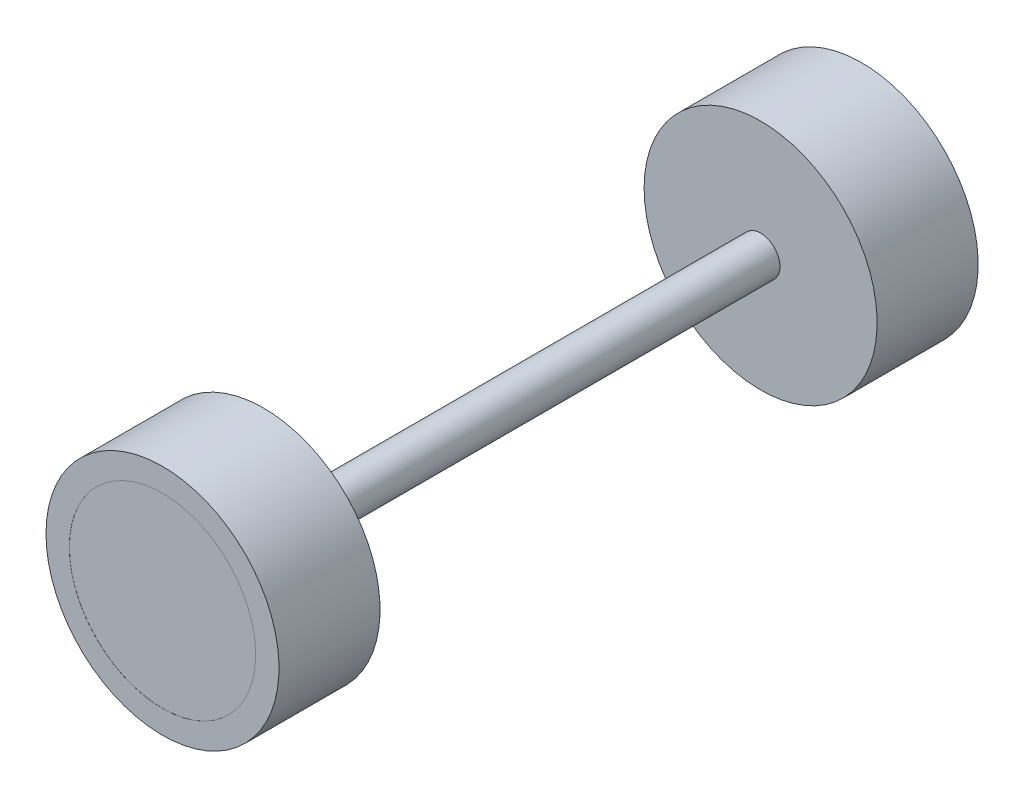
ISO-10303-21;
HEADER;
FILE_DESCRIPTION(('STEP AP214'),'2;1');
FILE_NAME('part.step','',(''),(''),'','','');
FILE_SCHEMA(('AUTOMOTIVE_DESIGN { 1 0 10303 214 1 1 1 1 }'));
ENDSEC;
DATA;
#1=APPLICATION_CONTEXT('core data for automotive mechanical design processes');
#2=APPLICATION_PROTOCOL_DEFINITION('international standard','automotive_design',2000,#1);
#3=PRODUCT_CONTEXT('',#1,'mechanical');
#4=PRODUCT('Part','Part','',(#3));
#5=PRODUCT_RELATED_PRODUCT_CATEGORY('part','',(#4));
#6=PRODUCT_DEFINITION_FORMATION('','',#4);
#7=PRODUCT_DEFINITION_CONTEXT('part definition',#1,'design');
#8=PRODUCT_DEFINITION('design','',#6,#7);
#9=PRODUCT_DEFINITION_SHAPE('','',#8);
#10=(LENGTH_UNIT() NAMED_UNIT(*) SI_UNIT(.MILLI.,.METRE.));
#11=(NAMED_UNIT(*) PLANE_ANGLE_UNIT() SI_UNIT($,.RADIAN.));
#12=(NAMED_UNIT(*) SI_UNIT($,.STERADIAN.) SOLID_ANGLE_UNIT());
#13=UNCERTAINTY_MEASURE_WITH_UNIT(LENGTH_MEASURE(1.E-05),#10,'distance_accuracy_value','');
#14=(GEOMETRIC_REPRESENTATION_CONTEXT(3) GLOBAL_UNCERTAINTY_ASSIGNED_CONTEXT((#13)) GLOBAL_UNIT_ASSIGNED_CONTEXT((#10,
#11,#12)) REPRESENTATION_CONTEXT('',''));
#15=CARTESIAN_POINT('',(0.,0.,0.));
#16=DIRECTION('',(0.,0.,1.));
#17=DIRECTION('',(1.,0.,0.));
#18=AXIS2_PLACEMENT_3D('',#15,#16,#17);
#19=CARTESIAN_POINT('',(15.,0.,13.));
#20=DIRECTION('',(0.,0.,1.));
#21=DIRECTION('',(1.,0.,0.));
#22=AXIS2_PLACEMENT_3D('',#19,#20,#21);
#23=PLANE('',#22);
#24=CARTESIAN_POINT('',(0.,0.,13.));
#25=DIRECTION('',(0.,0.,1.));
#26=DIRECTION('',(1.,0.,0.));
#27=AXIS2_PLACEMENT_3D('',#24,#25,#26);
#28=CIRCLE('',#27,15.);
#29=CARTESIAN_POINT('',(-15.,0.,13.));
#30=VERTEX_POINT('',#29);
#31=EDGE_CURVE('E11',#30,#30,#28,.T.);
#32=ORIENTED_EDGE('',*,*,#31,.T.);
#33=EDGE_LOOP('',(#32));
#34=FACE_BOUND('',#33,.T.);
#35=ADVANCED_FACE('F46',(#34),#23,.T.);
#36=CARTESIAN_POINT('',(0.,0.,13.));
#37=DIRECTION('',(0.,0.,-1.));
#38=DIRECTION('',(-1.,0.,0.));
#39=AXIS2_PLACEMENT_3D('',#36,#37,#38);
#40=CYLINDRICAL_SURFACE('',#39,15.);
#41=CARTESIAN_POINT('',(0.,0.,-0.01));
#42=DIRECTION('',(0.,0.,-1.));
#43=DIRECTION('',(-1.,0.,0.));
#44=AXIS2_PLACEMENT_3D('',#41,#42,#43);
#45=CIRCLE('',#44,15.);
#46=CARTESIAN_POINT('',(-15.,0.,-0.00999999999999959));
#47=VERTEX_POINT('',#46);
#48=EDGE_CURVE('E52',#47,#47,#45,.T.);
#49=CARTESIAN_POINT('',(-15.,0.,13.));
#50=CARTESIAN_POINT('',(-15.,0.,12.8644791666667));
#51=CARTESIAN_POINT('',(-15.,0.,12.7289583333333));
#52=CARTESIAN_POINT('',(-15.,0.,12.4579166666667));
#53=CARTESIAN_POINT('',(-15.,0.,12.3223958333333));
#54=CARTESIAN_POINT('',(-15.,0.,12.0513541666667));
#55=CARTESIAN_POINT('',(-15.,0.,11.9158333333333));
#56=CARTESIAN_POINT('',(-15.,0.,11.6447916666667));
#57=CARTESIAN_POINT('',(-15.,0.,11.5092708333333));
#58=CARTESIAN_POINT('',(-15.,0.,11.2382291666667));
#59=CARTESIAN_POINT('',(-15.,0.,11.1027083333333));
#60=CARTESIAN_POINT('',(-15.,0.,10.8316666666667));
#61=CARTESIAN_POINT('',(-15.,0.,10.6961458333333));
#62=CARTESIAN_POINT('',(-15.,0.,10.4251041666667));
#63=CARTESIAN_POINT('',(-15.,0.,10.2895833333333));
#64=CARTESIAN_POINT('',(-15.,0.,10.0185416666667));
#65=CARTESIAN_POINT('',(-15.,0.,9.88302083333333));
#66=CARTESIAN_POINT('',(-15.,0.,9.61197916666667));
#67=CARTESIAN_POINT('',(-15.,0.,9.47645833333333));
#68=CARTESIAN_POINT('',(-15.,0.,9.20541666666667));
#69=CARTESIAN_POINT('',(-15.,0.,9.06989583333333));
#70=CARTESIAN_POINT('',(-15.,0.,8.79885416666667));
#71=CARTESIAN_POINT('',(-15.,0.,8.66333333333333));
#72=CARTESIAN_POINT('',(-15.,0.,8.39229166666667));
#73=CARTESIAN_POINT('',(-15.,0.,8.25677083333333));
#74=CARTESIAN_POINT('',(-15.,0.,7.98572916666667));
#75=CARTESIAN_POINT('',(-15.,0.,7.85020833333333));
#76=CARTESIAN_POINT('',(-15.,0.,7.57916666666667));
#77=CARTESIAN_POINT('',(-15.,0.,7.44364583333333));
#78=CARTESIAN_POINT('',(-15.,0.,7.17260416666667));
#79=CARTESIAN_POINT('',(-15.,0.,7.03708333333333));
#80=CARTESIAN_POINT('',(-15.,0.,6.76604166666667));
#81=CARTESIAN_POINT('',(-15.,0.,6.63052083333333));
#82=CARTESIAN_POINT('',(-15.,0.,6.35947916666667));
#83=CARTESIAN_POINT('',(-15.,0.,6.22395833333333));
#84=CARTESIAN_POINT('',(-15.,0.,5.95291666666667));
#85=CARTESIAN_POINT('',(-15.,0.,5.81739583333333));
#86=CARTESIAN_POINT('',(-15.,0.,5.54635416666667));
#87=CARTESIAN_POINT('',(-15.,0.,5.41083333333333));
#88=CARTESIAN_POINT('',(-15.,0.,5.13979166666667));
#89=CARTESIAN_POINT('',(-15.,0.,5.00427083333333));
#90=CARTESIAN_POINT('',(-15.,0.,4.73322916666667));
#91=CARTESIAN_POINT('',(-15.,0.,4.59770833333333));
#92=CARTESIAN_POINT('',(-15.,0.,4.32666666666667));
#93=CARTESIAN_POINT('',(-15.,0.,4.19114583333333));
#94=CARTESIAN_POINT('',(-15.,0.,3.92010416666667));
#95=CARTESIAN_POINT('',(-15.,0.,3.78458333333333));
#96=CARTESIAN_POINT('',(-15.,0.,3.51354166666667));
#97=CARTESIAN_POINT('',(-15.,0.,3.37802083333333));
#98=CARTESIAN_POINT('',(-15.,0.,3.10697916666667));
#99=CARTESIAN_POINT('',(-15.,0.,2.97145833333333));
#100=CARTESIAN_POINT('',(-15.,0.,2.70041666666667));
#101=CARTESIAN_POINT('',(-15.,0.,2.56489583333333));
#102=CARTESIAN_POINT('',(-15.,0.,2.29385416666667));
#103=CARTESIAN_POINT('',(-15.,0.,2.15833333333333));
#104=CARTESIAN_POINT('',(-15.,0.,1.88729166666667));
#105=CARTESIAN_POINT('',(-15.,0.,1.75177083333333));
#106=CARTESIAN_POINT('',(-15.,0.,1.48072916666667));
#107=CARTESIAN_POINT('',(-15.,0.,1.34520833333333));
#108=CARTESIAN_POINT('',(-15.,0.,1.07416666666667));
#109=CARTESIAN_POINT('',(-15.,0.,0.938645833333334));
#110=CARTESIAN_POINT('',(-15.,0.,0.667604166666667));
#111=CARTESIAN_POINT('',(-15.,0.,0.532083333333334));
#112=CARTESIAN_POINT('',(-15.,0.,0.261041666666668));
#113=CARTESIAN_POINT('',(-15.,0.,0.125520833333334));
#114=CARTESIAN_POINT('',(-15.,0.,-0.00999999999999959));
#115=B_SPLINE_CURVE_WITH_KNOTS('',3,(#49,#50,#51,#52,#53,#54,#55,#56,#57,#58,#59,#60,#61,#62,
#63,#64,#65,#66,#67,#68,#69,#70,#71,#72,#73,#74,#75,#76,#77,#78,#79,#80,#81,#82,#83,#84,#85,#86,
#87,#88,#89,#90,#91,#92,#93,#94,#95,#96,#97,#98,#99,#100,#101,#102,#103,#104,#105,#106,#107,
#108,#109,#110,#111,#112,#113,#114),.UNSPECIFIED.,.F.,.F.,(4,2,2,2,2,2,2,2,2,2,2,2,2,2,2,2,2,2,
2,2,2,2,2,2,2,2,2,2,2,2,2,2,4),(0.,0.406562499999999,0.813125,1.2196875,1.62625,2.0328125,
2.439375,2.8459375,3.2525,3.6590625,4.065625,4.4721875,4.87875,5.2853125,5.691875,6.0984375,
6.505,6.9115625,7.318125,7.7246875,8.13125,8.5378125,8.944375,9.3509375,9.7575,10.1640625,
10.570625,10.9771875,11.38375,11.7903125,12.196875,12.6034375,13.01),.UNSPECIFIED.);
#116=EDGE_CURVE('BSEAM77',#30,#47,#115,.T.);
#117=ORIENTED_EDGE('',*,*,#31,.F.);
#118=ORIENTED_EDGE('',*,*,#48,.F.);
#119=ORIENTED_EDGE('',*,*,#116,.T.);
#120=ORIENTED_EDGE('',*,*,#116,.F.);
#121=EDGE_LOOP('',(#117,#119,#118,#120));
#122=FACE_BOUND('',#121,.T.);
#123=ADVANCED_FACE('F77',(#122),#40,.T.);
#124=CARTESIAN_POINT('',(0.,0.,-0.01));
#125=DIRECTION('',(0.,0.,-1.));
#126=DIRECTION('',(-1.,0.,0.));
#127=AXIS2_PLACEMENT_3D('',#124,#125,#126);
#128=PLANE('',#127);
#129=ORIENTED_EDGE('',*,*,#48,.T.);
#130=EDGE_LOOP('',(#129));
#131=FACE_BOUND('',#130,.T.);
#132=CARTESIAN_POINT('',(0.,0.,-0.01));
#133=DIRECTION('',(0.,0.,-1.));
#134=DIRECTION('',(-1.,0.,0.));
#135=AXIS2_PLACEMENT_3D('',#132,#133,#134);
#136=CIRCLE('',#135,12.);
#137=CARTESIAN_POINT('',(12.,0.,-0.01));
#138=VERTEX_POINT('',#137);
#139=EDGE_CURVE('E56',#138,#138,#136,.T.);
#140=ORIENTED_EDGE('',*,*,#139,.F.);
#141=EDGE_LOOP('',(#140));
#142=FACE_BOUND('',#141,.T.);
#143=ADVANCED_FACE('F70',(#131,#142),#128,.T.);
#144=CARTESIAN_POINT('',(0.,0.,-0.01));
#145=DIRECTION('',(0.,0.,1.));
#146=DIRECTION('',(1.,0.,0.));
#147=AXIS2_PLACEMENT_3D('',#144,#145,#146);
#148=CYLINDRICAL_SURFACE('',#147,12.);
#149=CARTESIAN_POINT('',(0.,0.,0.));
#150=DIRECTION('',(0.,0.,-1.));
#151=DIRECTION('',(-1.,0.,0.));
#152=AXIS2_PLACEMENT_3D('',#149,#150,#151);
#153=CIRCLE('',#152,12.);
#154=CARTESIAN_POINT('',(12.,0.,0.));
#155=VERTEX_POINT('',#154);
#156=EDGE_CURVE('E60',#155,#155,#153,.T.);
#157=CARTESIAN_POINT('',(12.,0.,-0.01));
#158=CARTESIAN_POINT('',(12.,0.,-0.00989583333333333));
#159=CARTESIAN_POINT('',(12.,0.,-0.00979166666666667));
#160=CARTESIAN_POINT('',(12.,0.,-0.00958333333333333));
#161=CARTESIAN_POINT('',(12.,0.,-0.00947916666666667));
#162=CARTESIAN_POINT('',(12.,0.,-0.00927083333333333));
#163=CARTESIAN_POINT('',(12.,0.,-0.00916666666666667));
#164=CARTESIAN_POINT('',(12.,0.,-0.00895833333333333));
#165=CARTESIAN_POINT('',(12.,0.,-0.00885416666666667));
#166=CARTESIAN_POINT('',(12.,0.,-0.00864583333333333));
#167=CARTESIAN_POINT('',(12.,0.,-0.00854166666666667));
#168=CARTESIAN_POINT('',(12.,0.,-0.00833333333333333));
#169=CARTESIAN_POINT('',(12.,0.,-0.00822916666666667));
#170=CARTESIAN_POINT('',(12.,0.,-0.00802083333333333));
#171=CARTESIAN_POINT('',(12.,0.,-0.00791666666666667));
#172=CARTESIAN_POINT('',(12.,0.,-0.00770833333333333));
#173=CARTESIAN_POINT('',(12.,0.,-0.00760416666666667));
#174=CARTESIAN_POINT('',(12.,0.,-0.00739583333333333));
#175=CARTESIAN_POINT('',(12.,0.,-0.00729166666666667));
#176=CARTESIAN_POINT('',(12.,0.,-0.00708333333333333));
#177=CARTESIAN_POINT('',(12.,0.,-0.00697916666666667));
#178=CARTESIAN_POINT('',(12.,0.,-0.00677083333333333));
#179=CARTESIAN_POINT('',(12.,0.,-0.00666666666666667));
#180=CARTESIAN_POINT('',(12.,0.,-0.00645833333333333));
#181=CARTESIAN_POINT('',(12.,0.,-0.00635416666666667));
#182=CARTESIAN_POINT('',(12.,0.,-0.00614583333333333));
#183=CARTESIAN_POINT('',(12.,0.,-0.00604166666666667));
#184=CARTESIAN_POINT('',(12.,0.,-0.00583333333333333));
#185=CARTESIAN_POINT('',(12.,0.,-0.00572916666666667));
#186=CARTESIAN_POINT('',(12.,0.,-0.00552083333333333));
#187=CARTESIAN_POINT('',(12.,0.,-0.00541666666666667));
#188=CARTESIAN_POINT('',(12.,0.,-0.00520833333333333));
#189=CARTESIAN_POINT('',(12.,0.,-0.00510416666666667));
#190=CARTESIAN_POINT('',(12.,0.,-0.00489583333333333));
#191=CARTESIAN_POINT('',(12.,0.,-0.00479166666666667));
#192=CARTESIAN_POINT('',(12.,0.,-0.00458333333333333));
#193=CARTESIAN_POINT('',(12.,0.,-0.00447916666666667));
#194=CARTESIAN_POINT('',(12.,0.,-0.00427083333333333));
#195=CARTESIAN_POINT('',(12.,0.,-0.00416666666666667));
#196=CARTESIAN_POINT('',(12.,0.,-0.00395833333333333));
#197=CARTESIAN_POINT('',(12.,0.,-0.00385416666666667));
#198=CARTESIAN_POINT('',(12.,0.,-0.00364583333333333));
#199=CARTESIAN_POINT('',(12.,0.,-0.00354166666666667));
#200=CARTESIAN_POINT('',(12.,0.,-0.00333333333333333));
#201=CARTESIAN_POINT('',(12.,0.,-0.00322916666666667));
#202=CARTESIAN_POINT('',(12.,0.,-0.00302083333333333));
#203=CARTESIAN_POINT('',(12.,0.,-0.00291666666666667));
#204=CARTESIAN_POINT('',(12.,0.,-0.00270833333333333));
#205=CARTESIAN_POINT('',(12.,0.,-0.00260416666666667));
#206=CARTESIAN_POINT('',(12.,0.,-0.00239583333333333));
#207=CARTESIAN_POINT('',(12.,0.,-0.00229166666666667));
#208=CARTESIAN_POINT('',(12.,0.,-0.00208333333333333));
#209=CARTESIAN_POINT('',(12.,0.,-0.00197916666666667));
#210=CARTESIAN_POINT('',(12.,0.,-0.00177083333333333));
#211=CARTESIAN_POINT('',(12.,0.,-0.00166666666666667));
#212=CARTESIAN_POINT('',(12.,0.,-0.00145833333333333));
#213=CARTESIAN_POINT('',(12.,0.,-0.00135416666666667));
#214=CARTESIAN_POINT('',(12.,0.,-0.00114583333333333));
#215=CARTESIAN_POINT('',(12.,0.,-0.00104166666666667));
#216=CARTESIAN_POINT('',(12.,0.,-0.000833333333333334));
#217=CARTESIAN_POINT('',(12.,0.,-0.000729166666666667));
#218=CARTESIAN_POINT('',(12.,0.,-0.000520833333333334));
#219=CARTESIAN_POINT('',(12.,0.,-0.000416666666666667));
#220=CARTESIAN_POINT('',(12.,0.,-0.000208333333333334));
#221=CARTESIAN_POINT('',(12.,0.,-0.000104166666666667));
#222=CARTESIAN_POINT('',(12.,0.,0.));
#223=B_SPLINE_CURVE_WITH_KNOTS('',3,(#157,#158,#159,#160,#161,#162,#163,#164,#165,#166,#167,
#168,#169,#170,#171,#172,#173,#174,#175,#176,#177,#178,#179,#180,#181,#182,#183,#184,#185,#186,
#187,#188,#189,#190,#191,#192,#193,#194,#195,#196,#197,#198,#199,#200,#201,#202,#203,#204,#205,
#206,#207,#208,#209,#210,#211,#212,#213,#214,#215,#216,#217,#218,#219,#220,#221,#222),
.UNSPECIFIED.,.F.,.F.,(4,2,2,2,2,2,2,2,2,2,2,2,2,2,2,2,2,2,2,2,2,2,2,2,2,2,2,2,2,2,2,2,4),(0.,
0.000312500000000001,0.000625000000000002,0.000937500000000001,0.00125,0.0015625,0.001875,
0.0021875,0.0025,0.0028125,0.003125,0.0034375,0.00375,0.0040625,0.004375,0.0046875,0.005,
0.0053125,0.005625,0.0059375,0.00625,0.0065625,0.006875,0.0071875,0.0075,0.0078125,0.008125,
0.0084375,0.00875,0.0090625,0.009375,0.0096875,0.01),.UNSPECIFIED.);
#224=EDGE_CURVE('BSEAM68',#138,#155,#223,.T.);
#225=ORIENTED_EDGE('',*,*,#139,.T.);
#226=ORIENTED_EDGE('',*,*,#156,.F.);
#227=ORIENTED_EDGE('',*,*,#224,.T.);
#228=ORIENTED_EDGE('',*,*,#224,.F.);
#229=EDGE_LOOP('',(#225,#227,#226,#228));
#230=FACE_BOUND('',#229,.T.);
#231=ADVANCED_FACE('F68',(#230),#148,.F.);
#232=CARTESIAN_POINT('',(0.,0.,0.));
#233=DIRECTION('',(0.,0.,1.));
#234=DIRECTION('',(1.,0.,0.));
#235=AXIS2_PLACEMENT_3D('',#232,#233,#234);
#236=PLANE('',#235);
#237=ORIENTED_EDGE('',*,*,#156,.T.);
#238=EDGE_LOOP('',(#237));
#239=FACE_BOUND('',#238,.T.);
#240=ADVANCED_FACE('F66',(#239),#236,.F.);
#241=CLOSED_SHELL('',(#35,#123,#143,#231,#240));
#242=MANIFOLD_SOLID_BREP('B2',#241);
#243=CARTESIAN_POINT('',(15.,0.,13.));
#244=DIRECTION('',(0.,0.,1.));
#245=DIRECTION('',(1.,0.,0.));
#246=AXIS2_PLACEMENT_3D('',#243,#244,#245);
#247=PLANE('',#246);
#248=CARTESIAN_POINT('',(0.,0.,13.));
#249=DIRECTION('',(0.,0.,1.));
#250=DIRECTION('',(1.,0.,0.));
#251=AXIS2_PLACEMENT_3D('',#248,#249,#250);
#252=CIRCLE('',#251,2.5);
#253=CARTESIAN_POINT('',(2.5,0.,13.));
#254=VERTEX_POINT('',#253);
#255=EDGE_CURVE('E45',#254,#254,#252,.T.);
#256=ORIENTED_EDGE('',*,*,#255,.F.);
#257=EDGE_LOOP('',(#256));
#258=FACE_BOUND('',#257,.T.);
#259=ADVANCED_FACE('F143',(#258),#247,.F.);
#260=CARTESIAN_POINT('',(0.,0.,45.));
#261=DIRECTION('',(0.,0.,-1.));
#262=DIRECTION('',(-1.,0.,0.));
#263=AXIS2_PLACEMENT_3D('',#260,#261,#262);
#264=CYLINDRICAL_SURFACE('',#263,2.5);
#265=ORIENTED_EDGE('',*,*,#255,.T.);
#266=EDGE_LOOP('',(#265));
#267=FACE_BOUND('',#266,.T.);
#268=CARTESIAN_POINT('',(0.,0.,77.));
#269=DIRECTION('',(0.,0.,1.));
#270=DIRECTION('',(1.,0.,0.));
#271=AXIS2_PLACEMENT_3D('',#268,#269,#270);
#272=CIRCLE('',#271,2.5);
#273=CARTESIAN_POINT('',(2.5,0.,77.));
#274=VERTEX_POINT('',#273);
#275=EDGE_CURVE('E149',#274,#274,#272,.T.);
#276=ORIENTED_EDGE('',*,*,#275,.F.);
#277=EDGE_LOOP('',(#276));
#278=FACE_BOUND('',#277,.T.);
#279=ADVANCED_FACE('F188',(#267,#278),#264,.T.);
#280=CARTESIAN_POINT('',(0.,0.,77.));
#281=DIRECTION('',(0.,0.,-1.));
#282=DIRECTION('',(1.,0.,0.));
#283=AXIS2_PLACEMENT_3D('',#280,#281,#282);
#284=PLANE('',#283);
#285=ORIENTED_EDGE('',*,*,#275,.T.);
#286=EDGE_LOOP('',(#285));
#287=FACE_BOUND('',#286,.T.);
#288=CARTESIAN_POINT('',(0.,0.,77.));
#289=DIRECTION('',(0.,0.,1.));
#290=DIRECTION('',(1.,0.,0.));
#291=AXIS2_PLACEMENT_3D('',#288,#289,#290);
#292=CIRCLE('',#291,15.);
#293=CARTESIAN_POINT('',(-15.,0.,77.));
#294=VERTEX_POINT('',#293);
#295=EDGE_CURVE('E153',#294,#294,#292,.T.);
#296=ORIENTED_EDGE('',*,*,#295,.F.);
#297=EDGE_LOOP('',(#296));
#298=FACE_BOUND('',#297,.T.);
#299=ADVANCED_FACE('F183',(#287,#298),#284,.T.);
#300=CARTESIAN_POINT('',(0.,0.,77.));
#301=DIRECTION('',(0.,0.,1.));
#302=DIRECTION('',(-1.,0.,0.));
#303=AXIS2_PLACEMENT_3D('',#300,#301,#302);
#304=CYLINDRICAL_SURFACE('',#303,15.);
#305=CARTESIAN_POINT('',(0.,0.,90.01));
#306=DIRECTION('',(0.,0.,1.));
#307=DIRECTION('',(1.,0.,0.));
#308=AXIS2_PLACEMENT_3D('',#305,#306,#307);
#309=CIRCLE('',#308,15.);
#310=CARTESIAN_POINT('',(-15.,0.,90.01));
#311=VERTEX_POINT('',#310);
#312=EDGE_CURVE('E157',#311,#311,#309,.T.);
#313=CARTESIAN_POINT('',(-15.,0.,77.));
#314=CARTESIAN_POINT('',(-15.,0.,77.1355208333333));
#315=CARTESIAN_POINT('',(-15.,0.,77.2710416666667));
#316=CARTESIAN_POINT('',(-15.,0.,77.5420833333333));
#317=CARTESIAN_POINT('',(-15.,0.,77.6776041666667));
#318=CARTESIAN_POINT('',(-15.,0.,77.9486458333333));
#319=CARTESIAN_POINT('',(-15.,0.,78.0841666666667));
#320=CARTESIAN_POINT('',(-15.,0.,78.3552083333333));
#321=CARTESIAN_POINT('',(-15.,0.,78.4907291666667));
#322=CARTESIAN_POINT('',(-15.,0.,78.7617708333333));
#323=CARTESIAN_POINT('',(-15.,0.,78.8972916666667));
#324=CARTESIAN_POINT('',(-15.,0.,79.1683333333333));
#325=CARTESIAN_POINT('',(-15.,0.,79.3038541666667));
#326=CARTESIAN_POINT('',(-15.,0.,79.5748958333333));
#327=CARTESIAN_POINT('',(-15.,0.,79.7104166666667));
#328=CARTESIAN_POINT('',(-15.,0.,79.9814583333333));
#329=CARTESIAN_POINT('',(-15.,0.,80.1169791666667));
#330=CARTESIAN_POINT('',(-15.,0.,80.3880208333333));
#331=CARTESIAN_POINT('',(-15.,0.,80.5235416666667));
#332=CARTESIAN_POINT('',(-15.,0.,80.7945833333333));
#333=CARTESIAN_POINT('',(-15.,0.,80.9301041666667));
#334=CARTESIAN_POINT('',(-15.,0.,81.2011458333333));
#335=CARTESIAN_POINT('',(-15.,0.,81.3366666666667));
#336=CARTESIAN_POINT('',(-15.,0.,81.6077083333333));
#337=CARTESIAN_POINT('',(-15.,0.,81.7432291666667));
#338=CARTESIAN_POINT('',(-15.,0.,82.0142708333333));
#339=CARTESIAN_POINT('',(-15.,0.,82.1497916666667));
#340=CARTESIAN_POINT('',(-15.,0.,82.4208333333333));
#341=CARTESIAN_POINT('',(-15.,0.,82.5563541666667));
#342=CARTESIAN_POINT('',(-15.,0.,82.8273958333333));
#343=CARTESIAN_POINT('',(-15.,0.,82.9629166666666));
#344=CARTESIAN_POINT('',(-15.,0.,83.2339583333333));
#345=CARTESIAN_POINT('',(-15.,0.,83.3694791666667));
#346=CARTESIAN_POINT('',(-15.,0.,83.6405208333333));
#347=CARTESIAN_POINT('',(-15.,0.,83.7760416666667));
#348=CARTESIAN_POINT('',(-15.,0.,84.0470833333333));
#349=CARTESIAN_POINT('',(-15.,0.,84.1826041666667));
#350=CARTESIAN_POINT('',(-15.,0.,84.4536458333333));
#351=CARTESIAN_POINT('',(-15.,0.,84.5891666666667));
#352=CARTESIAN_POINT('',(-15.,0.,84.8602083333333));
#353=CARTESIAN_POINT('',(-15.,0.,84.9957291666667));
#354=CARTESIAN_POINT('',(-15.,0.,85.2667708333333));
#355=CARTESIAN_POINT('',(-15.,0.,85.4022916666667));
#356=CARTESIAN_POINT('',(-15.,0.,85.6733333333333));
#357=CARTESIAN_POINT('',(-15.,0.,85.8088541666667));
#358=CARTESIAN_POINT('',(-15.,0.,86.0798958333333));
#359=CARTESIAN_POINT('',(-15.,0.,86.2154166666667));
#360=CARTESIAN_POINT('',(-15.,0.,86.4864583333333));
#361=CARTESIAN_POINT('',(-15.,0.,86.6219791666666));
#362=CARTESIAN_POINT('',(-15.,0.,86.8930208333333));
#363=CARTESIAN_POINT('',(-15.,0.,87.0285416666667));
#364=CARTESIAN_POINT('',(-15.,0.,87.2995833333333));
#365=CARTESIAN_POINT('',(-15.,0.,87.4351041666666));
#366=CARTESIAN_POINT('',(-15.,0.,87.7061458333333));
#367=CARTESIAN_POINT('',(-15.,0.,87.8416666666667));
#368=CARTESIAN_POINT('',(-15.,0.,88.1127083333333));
#369=CARTESIAN_POINT('',(-15.,0.,88.2482291666666));
#370=CARTESIAN_POINT('',(-15.,0.,88.5192708333333));
#371=CARTESIAN_POINT('',(-15.,0.,88.6547916666667));
#372=CARTESIAN_POINT('',(-15.,0.,88.9258333333333));
#373=CARTESIAN_POINT('',(-15.,0.,89.0613541666666));
#374=CARTESIAN_POINT('',(-15.,0.,89.3323958333333));
#375=CARTESIAN_POINT('',(-15.,0.,89.4679166666667));
#376=CARTESIAN_POINT('',(-15.,0.,89.7389583333333));
#377=CARTESIAN_POINT('',(-15.,0.,89.8744791666667));
#378=CARTESIAN_POINT('',(-15.,0.,90.01));
#379=B_SPLINE_CURVE_WITH_KNOTS('',3,(#313,#314,#315,#316,#317,#318,#319,#320,#321,#322,#323,
#324,#325,#326,#327,#328,#329,#330,#331,#332,#333,#334,#335,#336,#337,#338,#339,#340,#341,#342,
#343,#344,#345,#346,#347,#348,#349,#350,#351,#352,#353,#354,#355,#356,#357,#358,#359,#360,#361,
#362,#363,#364,#365,#366,#367,#368,#369,#370,#371,#372,#373,#374,#375,#376,#377,#378),
.UNSPECIFIED.,.F.,.F.,(4,2,2,2,2,2,2,2,2,2,2,2,2,2,2,2,2,2,2,2,2,2,2,2,2,2,2,2,2,2,2,2,4),(0.,
0.406562500000013,0.813125000000012,1.21968750000001,1.62625000000001,2.03281250000001,
2.43937500000001,2.84593750000001,3.25250000000001,3.6590625,4.065625,4.4721875,4.87875,
5.2853125,5.691875,6.0984375,6.50500000000001,6.91156250000001,7.31812500000001,
7.72468750000001,8.13125000000001,8.5378125,8.944375,9.3509375,9.7575,10.1640625,10.570625,
10.9771875,11.38375,11.7903125,12.196875,12.6034375,13.01),.UNSPECIFIED.);
#380=EDGE_CURVE('BSEAM174',#294,#311,#379,.T.);
#381=ORIENTED_EDGE('',*,*,#295,.T.);
#382=ORIENTED_EDGE('',*,*,#312,.F.);
#383=ORIENTED_EDGE('',*,*,#380,.T.);
#384=ORIENTED_EDGE('',*,*,#380,.F.);
#385=EDGE_LOOP('',(#381,#383,#382,#384));
#386=FACE_BOUND('',#385,.T.);
#387=ADVANCED_FACE('F174',(#386),#304,.T.);
#388=CARTESIAN_POINT('',(0.,0.,90.01));
#389=DIRECTION('',(0.,0.,1.));
#390=DIRECTION('',(1.,0.,0.));
#391=AXIS2_PLACEMENT_3D('',#388,#389,#390);
#392=PLANE('',#391);
#393=ORIENTED_EDGE('',*,*,#312,.T.);
#394=EDGE_LOOP('',(#393));
#395=FACE_BOUND('',#394,.T.);
#396=CARTESIAN_POINT('',(0.,0.,90.01));
#397=DIRECTION('',(0.,0.,1.));
#398=DIRECTION('',(1.,0.,0.));
#399=AXIS2_PLACEMENT_3D('',#396,#397,#398);
#400=CIRCLE('',#399,12.);
#401=CARTESIAN_POINT('',(-12.,0.,90.01));
#402=VERTEX_POINT('',#401);
#403=EDGE_CURVE('E162',#402,#402,#400,.T.);
#404=ORIENTED_EDGE('',*,*,#403,.F.);
#405=EDGE_LOOP('',(#404));
#406=FACE_BOUND('',#405,.T.);
#407=ADVANCED_FACE('F172',(#395,#406),#392,.T.);
#408=CARTESIAN_POINT('',(0.,0.,90.01));
#409=DIRECTION('',(0.,0.,-1.));
#410=DIRECTION('',(-1.,0.,0.));
#411=AXIS2_PLACEMENT_3D('',#408,#409,#410);
#412=CYLINDRICAL_SURFACE('',#411,12.);
#413=CARTESIAN_POINT('',(0.,0.,90.));
#414=DIRECTION('',(0.,0.,1.));
#415=DIRECTION('',(1.,0.,0.));
#416=AXIS2_PLACEMENT_3D('',#413,#414,#415);
#417=CIRCLE('',#416,12.);
#418=CARTESIAN_POINT('',(-12.,0.,90.));
#419=VERTEX_POINT('',#418);
#420=EDGE_CURVE('E163',#419,#419,#417,.T.);
#421=CARTESIAN_POINT('',(-12.,0.,90.01));
#422=CARTESIAN_POINT('',(-12.,0.,90.0098958333333));
#423=CARTESIAN_POINT('',(-12.,0.,90.0097916666667));
#424=CARTESIAN_POINT('',(-12.,0.,90.0095833333333));
#425=CARTESIAN_POINT('',(-12.,0.,90.0094791666667));
#426=CARTESIAN_POINT('',(-12.,0.,90.0092708333333));
#427=CARTESIAN_POINT('',(-12.,0.,90.0091666666667));
#428=CARTESIAN_POINT('',(-12.,0.,90.0089583333333));
#429=CARTESIAN_POINT('',(-12.,0.,90.0088541666667));
#430=CARTESIAN_POINT('',(-12.,0.,90.0086458333333));
#431=CARTESIAN_POINT('',(-12.,0.,90.0085416666666));
#432=CARTESIAN_POINT('',(-12.,0.,90.0083333333333));
#433=CARTESIAN_POINT('',(-12.,0.,90.0082291666667));
#434=CARTESIAN_POINT('',(-12.,0.,90.0080208333333));
#435=CARTESIAN_POINT('',(-12.,0.,90.0079166666667));
#436=CARTESIAN_POINT('',(-12.,0.,90.0077083333333));
#437=CARTESIAN_POINT('',(-12.,0.,90.0076041666667));
#438=CARTESIAN_POINT('',(-12.,0.,90.0073958333333));
#439=CARTESIAN_POINT('',(-12.,0.,90.0072916666667));
#440=CARTESIAN_POINT('',(-12.,0.,90.0070833333333));
#441=CARTESIAN_POINT('',(-12.,0.,90.0069791666667));
#442=CARTESIAN_POINT('',(-12.,0.,90.0067708333333));
#443=CARTESIAN_POINT('',(-12.,0.,90.0066666666666));
#444=CARTESIAN_POINT('',(-12.,0.,90.0064583333333));
#445=CARTESIAN_POINT('',(-12.,0.,90.0063541666667));
#446=CARTESIAN_POINT('',(-12.,0.,90.0061458333333));
#447=CARTESIAN_POINT('',(-12.,0.,90.0060416666667));
#448=CARTESIAN_POINT('',(-12.,0.,90.0058333333333));
#449=CARTESIAN_POINT('',(-12.,0.,90.0057291666667));
#450=CARTESIAN_POINT('',(-12.,0.,90.0055208333333));
#451=CARTESIAN_POINT('',(-12.,0.,90.0054166666667));
#452=CARTESIAN_POINT('',(-12.,0.,90.0052083333333));
#453=CARTESIAN_POINT('',(-12.,0.,90.0051041666667));
#454=CARTESIAN_POINT('',(-12.,0.,90.0048958333333));
#455=CARTESIAN_POINT('',(-12.,0.,90.0047916666666));
#456=CARTESIAN_POINT('',(-12.,0.,90.0045833333333));
#457=CARTESIAN_POINT('',(-12.,0.,90.0044791666667));
#458=CARTESIAN_POINT('',(-12.,0.,90.0042708333333));
#459=CARTESIAN_POINT('',(-12.,0.,90.0041666666666));
#460=CARTESIAN_POINT('',(-12.,0.,90.0039583333333));
#461=CARTESIAN_POINT('',(-12.,0.,90.0038541666667));
#462=CARTESIAN_POINT('',(-12.,0.,90.0036458333333));
#463=CARTESIAN_POINT('',(-12.,0.,90.0035416666667));
#464=CARTESIAN_POINT('',(-12.,0.,90.0033333333333));
#465=CARTESIAN_POINT('',(-12.,0.,90.0032291666667));
#466=CARTESIAN_POINT('',(-12.,0.,90.0030208333333));
#467=CARTESIAN_POINT('',(-12.,0.,90.0029166666666));
#468=CARTESIAN_POINT('',(-12.,0.,90.0027083333333));
#469=CARTESIAN_POINT('',(-12.,0.,90.0026041666667));
#470=CARTESIAN_POINT('',(-12.,0.,90.0023958333333));
#471=CARTESIAN_POINT('',(-12.,0.,90.0022916666667));
#472=CARTESIAN_POINT('',(-12.,0.,90.0020833333333));
#473=CARTESIAN_POINT('',(-12.,0.,90.0019791666667));
#474=CARTESIAN_POINT('',(-12.,0.,90.0017708333333));
#475=CARTESIAN_POINT('',(-12.,0.,90.0016666666667));
#476=CARTESIAN_POINT('',(-12.,0.,90.0014583333333));
#477=CARTESIAN_POINT('',(-12.,0.,90.0013541666667));
#478=CARTESIAN_POINT('',(-12.,0.,90.0011458333333));
#479=CARTESIAN_POINT('',(-12.,0.,90.0010416666667));
#480=CARTESIAN_POINT('',(-12.,0.,90.0008333333333));
#481=CARTESIAN_POINT('',(-12.,0.,90.0007291666667));
#482=CARTESIAN_POINT('',(-12.,0.,90.0005208333333));
#483=CARTESIAN_POINT('',(-12.,0.,90.0004166666667));
#484=CARTESIAN_POINT('',(-12.,0.,90.0002083333333));
#485=CARTESIAN_POINT('',(-12.,0.,90.0001041666666));
#486=CARTESIAN_POINT('',(-12.,0.,90.));
#487=B_SPLINE_CURVE_WITH_KNOTS('',3,(#421,#422,#423,#424,#425,#426,#427,#428,#429,#430,#431,
#432,#433,#434,#435,#436,#437,#438,#439,#440,#441,#442,#443,#444,#445,#446,#447,#448,#449,#450,
#451,#452,#453,#454,#455,#456,#457,#458,#459,#460,#461,#462,#463,#464,#465,#466,#467,#468,#469,
#470,#471,#472,#473,#474,#475,#476,#477,#478,#479,#480,#481,#482,#483,#484,#485,#486),
.UNSPECIFIED.,.F.,.F.,(4,2,2,2,2,2,2,2,2,2,2,2,2,2,2,2,2,2,2,2,2,2,2,2,2,2,2,2,2,2,2,2,4),(0.,
0.000312499999988169,0.000624999999990217,0.000937499999992264,0.00124999999999431,
0.00156249999999636,0.00187499999999841,0.00218749999998658,0.00249999999998862,
0.00281249999999067,0.00312499999999272,0.00343749999999476,0.00374999999999681,
0.00406249999998498,0.00437499999998703,0.00468749999998908,0.00499999999999112,
0.00531249999999317,0.00562499999999522,0.00593749999999726,0.00624999999998543,
0.00656249999998748,0.00687499999998953,0.00718749999999158,0.00749999999999362,
0.00781249999999567,0.00812499999998384,0.00843749999998589,0.00874999999998793,
0.00906249999998998,0.00937499999999203,0.00968749999999408,0.00999999999999612),.UNSPECIFIED.);
#488=EDGE_CURVE('BSEAM169',#402,#419,#487,.T.);
#489=ORIENTED_EDGE('',*,*,#403,.T.);
#490=ORIENTED_EDGE('',*,*,#420,.F.);
#491=ORIENTED_EDGE('',*,*,#488,.T.);
#492=ORIENTED_EDGE('',*,*,#488,.F.);
#493=EDGE_LOOP('',(#489,#491,#490,#492));
#494=FACE_BOUND('',#493,.T.);
#495=ADVANCED_FACE('F169',(#494),#412,.F.);
#496=CARTESIAN_POINT('',(0.,0.,90.));
#497=DIRECTION('',(0.,0.,-1.));
#498=DIRECTION('',(1.,0.,0.));
#499=AXIS2_PLACEMENT_3D('',#496,#497,#498);
#500=PLANE('',#499);
#501=ORIENTED_EDGE('',*,*,#420,.T.);
#502=EDGE_LOOP('',(#501));
#503=FACE_BOUND('',#502,.T.);
#504=ADVANCED_FACE('F181',(#503),#500,.F.);
#505=CLOSED_SHELL('',(#259,#279,#299,#387,#407,#495,#504));
#506=MANIFOLD_SOLID_BREP('B6',#505);
#507=ADVANCED_BREP_SHAPE_REPRESENTATION('',(#18,#242,#506),#14);
#508=SHAPE_DEFINITION_REPRESENTATION(#9,#507);
ENDSEC;
END-ISO-10303-21;
